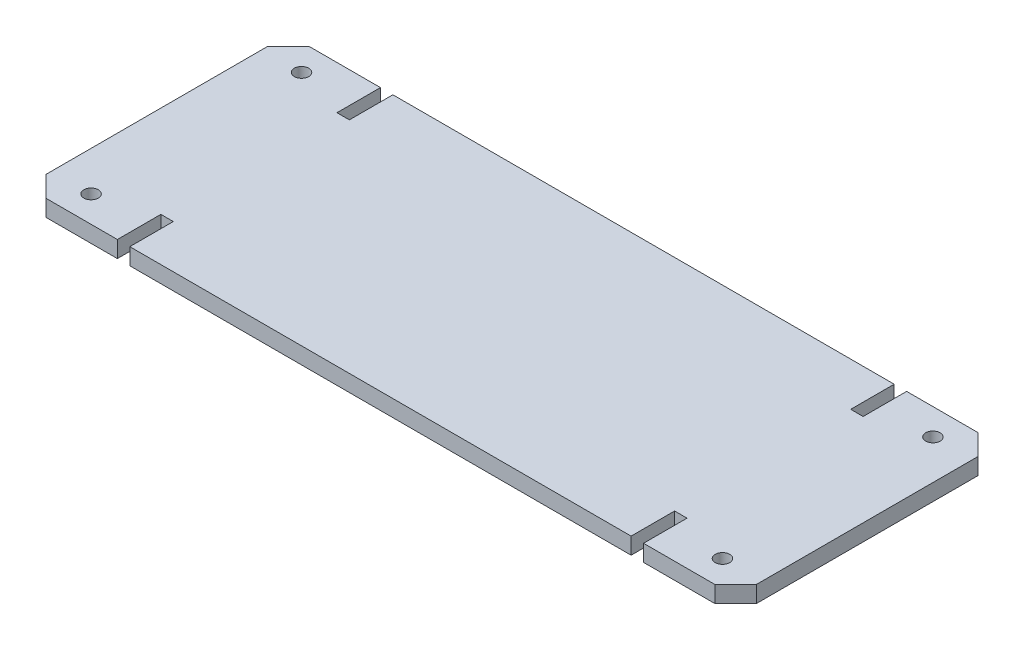
ISO-10303-21;
HEADER;
FILE_DESCRIPTION(('STEP AP214'),'2;1');
FILE_NAME('part.step','',(''),(''),'','','');
FILE_SCHEMA(('AUTOMOTIVE_DESIGN { 1 0 10303 214 1 1 1 1 }'));
ENDSEC;
DATA;
#1=APPLICATION_CONTEXT('core data for automotive mechanical design processes');
#2=APPLICATION_PROTOCOL_DEFINITION('international standard','automotive_design',2000,#1);
#3=PRODUCT_CONTEXT('',#1,'mechanical');
#4=PRODUCT('Part','Part','',(#3));
#5=PRODUCT_RELATED_PRODUCT_CATEGORY('part','',(#4));
#6=PRODUCT_DEFINITION_FORMATION('','',#4);
#7=PRODUCT_DEFINITION_CONTEXT('part definition',#1,'design');
#8=PRODUCT_DEFINITION('design','',#6,#7);
#9=PRODUCT_DEFINITION_SHAPE('','',#8);
#10=(LENGTH_UNIT() NAMED_UNIT(*) SI_UNIT(.MILLI.,.METRE.));
#11=(NAMED_UNIT(*) PLANE_ANGLE_UNIT() SI_UNIT($,.RADIAN.));
#12=(NAMED_UNIT(*) SI_UNIT($,.STERADIAN.) SOLID_ANGLE_UNIT());
#13=UNCERTAINTY_MEASURE_WITH_UNIT(LENGTH_MEASURE(1.E-05),#10,'distance_accuracy_value','');
#14=(GEOMETRIC_REPRESENTATION_CONTEXT(3) GLOBAL_UNCERTAINTY_ASSIGNED_CONTEXT((#13)) GLOBAL_UNIT_ASSIGNED_CONTEXT((#10,
#11,#12)) REPRESENTATION_CONTEXT('',''));
#15=CARTESIAN_POINT('',(0.,0.,0.));
#16=DIRECTION('',(0.,0.,1.));
#17=DIRECTION('',(1.,0.,0.));
#18=AXIS2_PLACEMENT_3D('',#15,#16,#17);
#19=CARTESIAN_POINT('',(-85.725,4.,-31.75));
#20=DIRECTION('',(0.,0.,1.));
#21=DIRECTION('',(1.,0.,0.));
#22=AXIS2_PLACEMENT_3D('',#19,#20,#21);
#23=PLANE('',#22);
#24=DIRECTION('',(-1.,0.,0.));
#25=VECTOR('',#24,1.);
#26=CARTESIAN_POINT('',(-85.725,4.,-31.75));
#27=LINE('',#26,#25);
#28=CARTESIAN_POINT('',(60.5,4.,-31.75));
#29=VERTEX_POINT('',#28);
#30=CARTESIAN_POINT('',(-60.5,4.,-31.75));
#31=VERTEX_POINT('',#30);
#32=EDGE_CURVE('E341',#29,#31,#27,.T.);
#33=ORIENTED_EDGE('',*,*,#32,.F.);
#34=DIRECTION('',(0.,1.,0.));
#35=VECTOR('',#34,1.);
#36=CARTESIAN_POINT('',(60.5,0.,-31.75));
#37=LINE('',#36,#35);
#38=CARTESIAN_POINT('',(60.5,0.,-31.75));
#39=VERTEX_POINT('',#38);
#40=EDGE_CURVE('E227',#39,#29,#37,.T.);
#41=ORIENTED_EDGE('',*,*,#40,.F.);
#42=DIRECTION('',(-1.,0.,0.));
#43=VECTOR('',#42,1.);
#44=CARTESIAN_POINT('',(-85.725,0.,-31.75));
#45=LINE('',#44,#43);
#46=CARTESIAN_POINT('',(-60.5,0.,-31.75));
#47=VERTEX_POINT('',#46);
#48=EDGE_CURVE('E218',#39,#47,#45,.T.);
#49=ORIENTED_EDGE('',*,*,#48,.T.);
#50=DIRECTION('',(0.,1.,0.));
#51=VECTOR('',#50,1.);
#52=CARTESIAN_POINT('',(-60.5,0.,-31.75));
#53=LINE('',#52,#51);
#54=EDGE_CURVE('E266',#47,#31,#53,.T.);
#55=ORIENTED_EDGE('',*,*,#54,.T.);
#56=EDGE_LOOP('',(#33,#41,#49,#55));
#57=FACE_BOUND('',#56,.T.);
#58=ADVANCED_FACE('F33',(#57),#23,.F.);
#59=CARTESIAN_POINT('',(80.725,0.,-31.75));
#60=VERTEX_POINT('',#59);
#61=CARTESIAN_POINT('',(63.5,0.,-31.75));
#62=VERTEX_POINT('',#61);
#63=EDGE_CURVE('E353',#60,#62,#45,.T.);
#64=ORIENTED_EDGE('',*,*,#63,.T.);
#65=DIRECTION('',(0.,1.,0.));
#66=VECTOR('',#65,1.);
#67=CARTESIAN_POINT('',(63.5,0.,-31.75));
#68=LINE('',#67,#66);
#69=CARTESIAN_POINT('',(63.5,4.,-31.75));
#70=VERTEX_POINT('',#69);
#71=EDGE_CURVE('E230',#62,#70,#68,.T.);
#72=ORIENTED_EDGE('',*,*,#71,.T.);
#73=CARTESIAN_POINT('',(80.725,4.,-31.75));
#74=VERTEX_POINT('',#73);
#75=EDGE_CURVE('E337',#74,#70,#27,.T.);
#76=ORIENTED_EDGE('',*,*,#75,.F.);
#77=DIRECTION('',(0.,-1.,0.));
#78=VECTOR('',#77,1.);
#79=CARTESIAN_POINT('',(80.725,4.,-31.75));
#80=LINE('',#79,#78);
#81=EDGE_CURVE('E391',#74,#60,#80,.T.);
#82=ORIENTED_EDGE('',*,*,#81,.T.);
#83=EDGE_LOOP('',(#64,#72,#76,#82));
#84=FACE_BOUND('',#83,.T.);
#85=ADVANCED_FACE('F414',(#84),#23,.F.);
#86=CARTESIAN_POINT('',(-85.725,4.,31.75));
#87=DIRECTION('',(0.,0.,-1.));
#88=DIRECTION('',(-1.,0.,0.));
#89=AXIS2_PLACEMENT_3D('',#86,#87,#88);
#90=PLANE('',#89);
#91=DIRECTION('',(1.,0.,0.));
#92=VECTOR('',#91,1.);
#93=CARTESIAN_POINT('',(-85.725,0.,31.75));
#94=LINE('',#93,#92);
#95=CARTESIAN_POINT('',(-80.7249999999999,0.,31.75));
#96=VERTEX_POINT('',#95);
#97=CARTESIAN_POINT('',(-63.5,0.,31.75));
#98=VERTEX_POINT('',#97);
#99=EDGE_CURVE('E336',#96,#98,#94,.T.);
#100=ORIENTED_EDGE('',*,*,#99,.T.);
#101=DIRECTION('',(0.,1.,0.));
#102=VECTOR('',#101,1.);
#103=CARTESIAN_POINT('',(-63.5,0.,31.75));
#104=LINE('',#103,#102);
#105=CARTESIAN_POINT('',(-63.5,4.,31.75));
#106=VERTEX_POINT('',#105);
#107=EDGE_CURVE('E243',#98,#106,#104,.T.);
#108=ORIENTED_EDGE('',*,*,#107,.T.);
#109=DIRECTION('',(1.,0.,0.));
#110=VECTOR('',#109,1.);
#111=CARTESIAN_POINT('',(-85.725,4.,31.75));
#112=LINE('',#111,#110);
#113=CARTESIAN_POINT('',(-80.7249999999999,4.,31.75));
#114=VERTEX_POINT('',#113);
#115=EDGE_CURVE('E345',#114,#106,#112,.T.);
#116=ORIENTED_EDGE('',*,*,#115,.F.);
#117=DIRECTION('',(0.,-1.,0.));
#118=VECTOR('',#117,1.);
#119=CARTESIAN_POINT('',(-80.7249999999999,4.,31.75));
#120=LINE('',#119,#118);
#121=EDGE_CURVE('E365',#114,#96,#120,.T.);
#122=ORIENTED_EDGE('',*,*,#121,.T.);
#123=EDGE_LOOP('',(#100,#108,#116,#122));
#124=FACE_BOUND('',#123,.T.);
#125=ADVANCED_FACE('F451',(#124),#90,.F.);
#126=CARTESIAN_POINT('',(63.5,4.,31.75));
#127=VERTEX_POINT('',#126);
#128=CARTESIAN_POINT('',(80.725,4.,31.75));
#129=VERTEX_POINT('',#128);
#130=EDGE_CURVE('E344',#127,#129,#112,.T.);
#131=ORIENTED_EDGE('',*,*,#130,.F.);
#132=DIRECTION('',(0.,1.,0.));
#133=VECTOR('',#132,1.);
#134=CARTESIAN_POINT('',(63.5,0.,31.75));
#135=LINE('',#134,#133);
#136=CARTESIAN_POINT('',(63.5,0.,31.75));
#137=VERTEX_POINT('',#136);
#138=EDGE_CURVE('E299',#137,#127,#135,.T.);
#139=ORIENTED_EDGE('',*,*,#138,.F.);
#140=CARTESIAN_POINT('',(80.725,0.,31.75));
#141=VERTEX_POINT('',#140);
#142=EDGE_CURVE('E359',#137,#141,#94,.T.);
#143=ORIENTED_EDGE('',*,*,#142,.T.);
#144=DIRECTION('',(0.,1.,0.));
#145=VECTOR('',#144,1.);
#146=CARTESIAN_POINT('',(80.725,4.,31.75));
#147=LINE('',#146,#145);
#148=EDGE_CURVE('E348',#141,#129,#147,.T.);
#149=ORIENTED_EDGE('',*,*,#148,.T.);
#150=EDGE_LOOP('',(#131,#139,#143,#149));
#151=FACE_BOUND('',#150,.T.);
#152=ADVANCED_FACE('F421',(#151),#90,.F.);
#153=CARTESIAN_POINT('',(0.,4.,0.));
#154=DIRECTION('',(0.,-1.,0.));
#155=DIRECTION('',(0.,0.,-1.));
#156=AXIS2_PLACEMENT_3D('',#153,#154,#155);
#157=PLANE('',#156);
#158=DIRECTION('',(1.,0.,0.));
#159=VECTOR('',#158,1.);
#160=CARTESIAN_POINT('',(63.5,4.,-21.25));
#161=LINE('',#160,#159);
#162=CARTESIAN_POINT('',(60.5,4.,-21.25));
#163=VERTEX_POINT('',#162);
#164=CARTESIAN_POINT('',(63.5,4.,-21.25));
#165=VERTEX_POINT('',#164);
#166=EDGE_CURVE('E220',#163,#165,#161,.T.);
#167=ORIENTED_EDGE('',*,*,#166,.F.);
#168=DIRECTION('',(0.,0.,1.));
#169=VECTOR('',#168,1.);
#170=CARTESIAN_POINT('',(60.5,4.,-21.25));
#171=LINE('',#170,#169);
#172=EDGE_CURVE('E199',#29,#163,#171,.T.);
#173=ORIENTED_EDGE('',*,*,#172,.F.);
#174=ORIENTED_EDGE('',*,*,#32,.T.);
#175=DIRECTION('',(0.,0.,-1.));
#176=VECTOR('',#175,1.);
#177=CARTESIAN_POINT('',(-60.5,4.,-21.25));
#178=LINE('',#177,#176);
#179=CARTESIAN_POINT('',(-60.5,4.,-21.25));
#180=VERTEX_POINT('',#179);
#181=EDGE_CURVE('E267',#180,#31,#178,.T.);
#182=ORIENTED_EDGE('',*,*,#181,.F.);
#183=DIRECTION('',(1.,0.,0.));
#184=VECTOR('',#183,1.);
#185=CARTESIAN_POINT('',(-60.5,4.,-21.25));
#186=LINE('',#185,#184);
#187=CARTESIAN_POINT('',(-63.5,4.,-21.25));
#188=VERTEX_POINT('',#187);
#189=EDGE_CURVE('E261',#188,#180,#186,.T.);
#190=ORIENTED_EDGE('',*,*,#189,.F.);
#191=DIRECTION('',(0.,0.,1.));
#192=VECTOR('',#191,1.);
#193=CARTESIAN_POINT('',(-63.5,4.,-21.25));
#194=LINE('',#193,#192);
#195=CARTESIAN_POINT('',(-63.5,4.,-31.75));
#196=VERTEX_POINT('',#195);
#197=EDGE_CURVE('E269',#196,#188,#194,.T.);
#198=ORIENTED_EDGE('',*,*,#197,.F.);
#199=CARTESIAN_POINT('',(-80.725,4.,-31.75));
#200=VERTEX_POINT('',#199);
#201=EDGE_CURVE('E335',#196,#200,#27,.T.);
#202=ORIENTED_EDGE('',*,*,#201,.T.);
#203=DIRECTION('',(0.707106781186551,0.,-0.707106781186544));
#204=VECTOR('',#203,1.);
#205=CARTESIAN_POINT('',(-85.725,4.,-26.75));
#206=LINE('',#205,#204);
#207=CARTESIAN_POINT('',(-85.725,4.,-26.75));
#208=VERTEX_POINT('',#207);
#209=EDGE_CURVE('E387',#200,#208,#206,.F.);
#210=ORIENTED_EDGE('',*,*,#209,.T.);
#211=DIRECTION('',(0.,0.,1.));
#212=VECTOR('',#211,1.);
#213=CARTESIAN_POINT('',(-85.725,4.,31.75));
#214=LINE('',#213,#212);
#215=CARTESIAN_POINT('',(-85.725,4.,26.7499999999999));
#216=VERTEX_POINT('',#215);
#217=EDGE_CURVE('E340',#208,#216,#214,.T.);
#218=ORIENTED_EDGE('',*,*,#217,.T.);
#219=DIRECTION('',(-0.707106781186548,0.,-0.707106781186548));
#220=VECTOR('',#219,1.);
#221=CARTESIAN_POINT('',(-80.7249999999999,4.,31.75));
#222=LINE('',#221,#220);
#223=EDGE_CURVE('E389',#216,#114,#222,.F.);
#224=ORIENTED_EDGE('',*,*,#223,.T.);
#225=ORIENTED_EDGE('',*,*,#115,.T.);
#226=DIRECTION('',(0.,0.,1.));
#227=VECTOR('',#226,1.);
#228=CARTESIAN_POINT('',(-63.5,4.,31.75));
#229=LINE('',#228,#227);
#230=CARTESIAN_POINT('',(-63.5,4.,21.25));
#231=VERTEX_POINT('',#230);
#232=EDGE_CURVE('E244',#231,#106,#229,.T.);
#233=ORIENTED_EDGE('',*,*,#232,.F.);
#234=DIRECTION('',(-1.,0.,0.));
#235=VECTOR('',#234,1.);
#236=CARTESIAN_POINT('',(-60.5,4.,21.25));
#237=LINE('',#236,#235);
#238=CARTESIAN_POINT('',(-60.5,4.,21.25));
#239=VERTEX_POINT('',#238);
#240=EDGE_CURVE('E237',#239,#231,#237,.T.);
#241=ORIENTED_EDGE('',*,*,#240,.F.);
#242=DIRECTION('',(0.,0.,-1.));
#243=VECTOR('',#242,1.);
#244=CARTESIAN_POINT('',(-60.5,4.,31.75));
#245=LINE('',#244,#243);
#246=CARTESIAN_POINT('',(-60.5,4.,31.75));
#247=VERTEX_POINT('',#246);
#248=EDGE_CURVE('E246',#247,#239,#245,.T.);
#249=ORIENTED_EDGE('',*,*,#248,.F.);
#250=CARTESIAN_POINT('',(60.5,4.,31.75));
#251=VERTEX_POINT('',#250);
#252=EDGE_CURVE('E349',#247,#251,#112,.T.);
#253=ORIENTED_EDGE('',*,*,#252,.T.);
#254=DIRECTION('',(0.,0.,1.));
#255=VECTOR('',#254,1.);
#256=CARTESIAN_POINT('',(60.5,4.,31.75));
#257=LINE('',#256,#255);
#258=CARTESIAN_POINT('',(60.5,4.,21.25));
#259=VERTEX_POINT('',#258);
#260=EDGE_CURVE('E285',#259,#251,#257,.T.);
#261=ORIENTED_EDGE('',*,*,#260,.F.);
#262=DIRECTION('',(-1.,0.,0.));
#263=VECTOR('',#262,1.);
#264=CARTESIAN_POINT('',(63.5,4.,21.25));
#265=LINE('',#264,#263);
#266=CARTESIAN_POINT('',(63.5,4.,21.25));
#267=VERTEX_POINT('',#266);
#268=EDGE_CURVE('E294',#267,#259,#265,.T.);
#269=ORIENTED_EDGE('',*,*,#268,.F.);
#270=DIRECTION('',(0.,0.,-1.));
#271=VECTOR('',#270,1.);
#272=CARTESIAN_POINT('',(63.5,4.,31.75));
#273=LINE('',#272,#271);
#274=EDGE_CURVE('E229',#127,#267,#273,.T.);
#275=ORIENTED_EDGE('',*,*,#274,.F.);
#276=ORIENTED_EDGE('',*,*,#130,.T.);
#277=DIRECTION('',(-0.707106781186551,0.,0.707106781186544));
#278=VECTOR('',#277,1.);
#279=CARTESIAN_POINT('',(85.725,4.,26.75));
#280=LINE('',#279,#278);
#281=CARTESIAN_POINT('',(85.725,4.,26.75));
#282=VERTEX_POINT('',#281);
#283=EDGE_CURVE('E383',#129,#282,#280,.F.);
#284=ORIENTED_EDGE('',*,*,#283,.T.);
#285=DIRECTION('',(0.,0.,-1.));
#286=VECTOR('',#285,1.);
#287=CARTESIAN_POINT('',(85.725,4.,31.75));
#288=LINE('',#287,#286);
#289=CARTESIAN_POINT('',(85.725,4.,-26.7499999999999));
#290=VERTEX_POINT('',#289);
#291=EDGE_CURVE('E332',#282,#290,#288,.T.);
#292=ORIENTED_EDGE('',*,*,#291,.T.);
#293=DIRECTION('',(0.707106781186548,0.,0.707106781186548));
#294=VECTOR('',#293,1.);
#295=CARTESIAN_POINT('',(80.725,4.,-31.75));
#296=LINE('',#295,#294);
#297=EDGE_CURVE('E385',#290,#74,#296,.F.);
#298=ORIENTED_EDGE('',*,*,#297,.T.);
#299=ORIENTED_EDGE('',*,*,#75,.T.);
#300=DIRECTION('',(0.,0.,-1.));
#301=VECTOR('',#300,1.);
#302=CARTESIAN_POINT('',(63.5,4.,-21.25));
#303=LINE('',#302,#301);
#304=EDGE_CURVE('E48',#165,#70,#303,.T.);
#305=ORIENTED_EDGE('',*,*,#304,.F.);
#306=EDGE_LOOP('',(#167,#173,#174,#182,#190,#198,#202,#210,#218,#224,#225,#233,#241,#249,#253,
#261,#269,#275,#276,#284,#292,#298,#299,#305));
#307=FACE_BOUND('',#306,.T.);
#308=CARTESIAN_POINT('',(-76.2,4.,-25.4));
#309=DIRECTION('',(0.,1.,0.));
#310=DIRECTION('',(0.,0.,1.));
#311=AXIS2_PLACEMENT_3D('',#308,#309,#310);
#312=CIRCLE('',#311,1.75);
#313=CARTESIAN_POINT('',(-76.2,4.,-23.65));
#314=VERTEX_POINT('',#313);
#315=EDGE_CURVE('E326',#314,#314,#312,.T.);
#316=ORIENTED_EDGE('',*,*,#315,.F.);
#317=EDGE_LOOP('',(#316));
#318=FACE_BOUND('',#317,.T.);
#319=CARTESIAN_POINT('',(-76.2,4.,25.4));
#320=DIRECTION('',(0.,1.,0.));
#321=DIRECTION('',(0.,0.,1.));
#322=AXIS2_PLACEMENT_3D('',#319,#320,#321);
#323=CIRCLE('',#322,1.75);
#324=CARTESIAN_POINT('',(-76.2,4.,27.15));
#325=VERTEX_POINT('',#324);
#326=EDGE_CURVE('E320',#325,#325,#323,.T.);
#327=ORIENTED_EDGE('',*,*,#326,.F.);
#328=EDGE_LOOP('',(#327));
#329=FACE_BOUND('',#328,.T.);
#330=CARTESIAN_POINT('',(76.2,4.,-25.4));
#331=DIRECTION('',(0.,1.,0.));
#332=DIRECTION('',(0.,0.,1.));
#333=AXIS2_PLACEMENT_3D('',#330,#331,#332);
#334=CIRCLE('',#333,1.75);
#335=CARTESIAN_POINT('',(76.2,4.,-23.65));
#336=VERTEX_POINT('',#335);
#337=EDGE_CURVE('E314',#336,#336,#334,.T.);
#338=ORIENTED_EDGE('',*,*,#337,.F.);
#339=EDGE_LOOP('',(#338));
#340=FACE_BOUND('',#339,.T.);
#341=CARTESIAN_POINT('',(76.2,4.,25.4));
#342=DIRECTION('',(0.,1.,0.));
#343=DIRECTION('',(0.,0.,1.));
#344=AXIS2_PLACEMENT_3D('',#341,#342,#343);
#345=CIRCLE('',#344,1.75);
#346=CARTESIAN_POINT('',(76.2,4.,27.15));
#347=VERTEX_POINT('',#346);
#348=EDGE_CURVE('E308',#347,#347,#345,.T.);
#349=ORIENTED_EDGE('',*,*,#348,.F.);
#350=EDGE_LOOP('',(#349));
#351=FACE_BOUND('',#350,.T.);
#352=ADVANCED_FACE('F416',(#307,#318,#329,#340,#351),#157,.F.);
#353=CARTESIAN_POINT('',(0.,0.,0.));
#354=DIRECTION('',(0.,-1.,0.));
#355=DIRECTION('',(0.,0.,-1.));
#356=AXIS2_PLACEMENT_3D('',#353,#354,#355);
#357=PLANE('',#356);
#358=DIRECTION('',(0.,0.,1.));
#359=VECTOR('',#358,1.);
#360=CARTESIAN_POINT('',(60.5,0.,-21.25));
#361=LINE('',#360,#359);
#362=CARTESIAN_POINT('',(60.5,0.,-21.25));
#363=VERTEX_POINT('',#362);
#364=EDGE_CURVE('E196',#39,#363,#361,.T.);
#365=ORIENTED_EDGE('',*,*,#364,.T.);
#366=DIRECTION('',(1.,0.,0.));
#367=VECTOR('',#366,1.);
#368=CARTESIAN_POINT('',(63.5,0.,-21.25));
#369=LINE('',#368,#367);
#370=CARTESIAN_POINT('',(63.5,0.,-21.25));
#371=VERTEX_POINT('',#370);
#372=EDGE_CURVE('E207',#363,#371,#369,.T.);
#373=ORIENTED_EDGE('',*,*,#372,.T.);
#374=DIRECTION('',(0.,0.,-1.));
#375=VECTOR('',#374,1.);
#376=CARTESIAN_POINT('',(63.5,0.,-21.25));
#377=LINE('',#376,#375);
#378=EDGE_CURVE('E204',#371,#62,#377,.T.);
#379=ORIENTED_EDGE('',*,*,#378,.T.);
#380=ORIENTED_EDGE('',*,*,#63,.F.);
#381=DIRECTION('',(-0.707106781186548,0.,-0.707106781186548));
#382=VECTOR('',#381,1.);
#383=CARTESIAN_POINT('',(56.2375,0.,-56.2375));
#384=LINE('',#383,#382);
#385=CARTESIAN_POINT('',(85.725,0.,-26.7499999999999));
#386=VERTEX_POINT('',#385);
#387=EDGE_CURVE('E371',#60,#386,#384,.F.);
#388=ORIENTED_EDGE('',*,*,#387,.T.);
#389=DIRECTION('',(0.,0.,-1.));
#390=VECTOR('',#389,1.);
#391=CARTESIAN_POINT('',(85.725,0.,31.75));
#392=LINE('',#391,#390);
#393=CARTESIAN_POINT('',(85.725,0.,26.75));
#394=VERTEX_POINT('',#393);
#395=EDGE_CURVE('E329',#394,#386,#392,.T.);
#396=ORIENTED_EDGE('',*,*,#395,.F.);
#397=DIRECTION('',(0.707106781186551,0.,-0.707106781186544));
#398=VECTOR('',#397,1.);
#399=CARTESIAN_POINT('',(56.2374999999995,0.,56.2375000000002));
#400=LINE('',#399,#398);
#401=EDGE_CURVE('E368',#394,#141,#400,.F.);
#402=ORIENTED_EDGE('',*,*,#401,.T.);
#403=ORIENTED_EDGE('',*,*,#142,.F.);
#404=DIRECTION('',(0.,0.,-1.));
#405=VECTOR('',#404,1.);
#406=CARTESIAN_POINT('',(63.5,0.,31.75));
#407=LINE('',#406,#405);
#408=CARTESIAN_POINT('',(63.5,0.,21.25));
#409=VERTEX_POINT('',#408);
#410=EDGE_CURVE('E281',#137,#409,#407,.T.);
#411=ORIENTED_EDGE('',*,*,#410,.T.);
#412=DIRECTION('',(-1.,0.,0.));
#413=VECTOR('',#412,1.);
#414=CARTESIAN_POINT('',(63.5,0.,21.25));
#415=LINE('',#414,#413);
#416=CARTESIAN_POINT('',(60.5,0.,21.25));
#417=VERTEX_POINT('',#416);
#418=EDGE_CURVE('E284',#409,#417,#415,.T.);
#419=ORIENTED_EDGE('',*,*,#418,.T.);
#420=DIRECTION('',(0.,0.,1.));
#421=VECTOR('',#420,1.);
#422=CARTESIAN_POINT('',(60.5,0.,31.75));
#423=LINE('',#422,#421);
#424=CARTESIAN_POINT('',(60.5,0.,31.75));
#425=VERTEX_POINT('',#424);
#426=EDGE_CURVE('E288',#417,#425,#423,.T.);
#427=ORIENTED_EDGE('',*,*,#426,.T.);
#428=CARTESIAN_POINT('',(-60.5,0.,31.75));
#429=VERTEX_POINT('',#428);
#430=EDGE_CURVE('E362',#429,#425,#94,.T.);
#431=ORIENTED_EDGE('',*,*,#430,.F.);
#432=DIRECTION('',(0.,0.,-1.));
#433=VECTOR('',#432,1.);
#434=CARTESIAN_POINT('',(-60.5,0.,31.75));
#435=LINE('',#434,#433);
#436=CARTESIAN_POINT('',(-60.5,0.,21.25));
#437=VERTEX_POINT('',#436);
#438=EDGE_CURVE('E236',#429,#437,#435,.T.);
#439=ORIENTED_EDGE('',*,*,#438,.T.);
#440=DIRECTION('',(-1.,0.,0.));
#441=VECTOR('',#440,1.);
#442=CARTESIAN_POINT('',(-60.5,0.,21.25));
#443=LINE('',#442,#441);
#444=CARTESIAN_POINT('',(-63.5,0.,21.25));
#445=VERTEX_POINT('',#444);
#446=EDGE_CURVE('E240',#437,#445,#443,.T.);
#447=ORIENTED_EDGE('',*,*,#446,.T.);
#448=DIRECTION('',(0.,0.,1.));
#449=VECTOR('',#448,1.);
#450=CARTESIAN_POINT('',(-63.5,0.,31.75));
#451=LINE('',#450,#449);
#452=EDGE_CURVE('E233',#445,#98,#451,.T.);
#453=ORIENTED_EDGE('',*,*,#452,.T.);
#454=ORIENTED_EDGE('',*,*,#99,.F.);
#455=DIRECTION('',(0.707106781186548,0.,0.707106781186548));
#456=VECTOR('',#455,1.);
#457=CARTESIAN_POINT('',(-56.2375,0.,56.2375));
#458=LINE('',#457,#456);
#459=CARTESIAN_POINT('',(-85.725,0.,26.7499999999999));
#460=VERTEX_POINT('',#459);
#461=EDGE_CURVE('E376',#96,#460,#458,.F.);
#462=ORIENTED_EDGE('',*,*,#461,.T.);
#463=DIRECTION('',(0.,0.,1.));
#464=VECTOR('',#463,1.);
#465=CARTESIAN_POINT('',(-85.725,0.,31.75));
#466=LINE('',#465,#464);
#467=CARTESIAN_POINT('',(-85.725,0.,-26.75));
#468=VERTEX_POINT('',#467);
#469=EDGE_CURVE('E356',#468,#460,#466,.T.);
#470=ORIENTED_EDGE('',*,*,#469,.F.);
#471=DIRECTION('',(-0.707106781186551,0.,0.707106781186544));
#472=VECTOR('',#471,1.);
#473=CARTESIAN_POINT('',(-56.2374999999995,0.,-56.2375000000002));
#474=LINE('',#473,#472);
#475=CARTESIAN_POINT('',(-80.725,0.,-31.75));
#476=VERTEX_POINT('',#475);
#477=EDGE_CURVE('E373',#468,#476,#474,.F.);
#478=ORIENTED_EDGE('',*,*,#477,.T.);
#479=CARTESIAN_POINT('',(-63.5,0.,-31.75));
#480=VERTEX_POINT('',#479);
#481=EDGE_CURVE('E352',#480,#476,#45,.T.);
#482=ORIENTED_EDGE('',*,*,#481,.F.);
#483=DIRECTION('',(0.,0.,1.));
#484=VECTOR('',#483,1.);
#485=CARTESIAN_POINT('',(-63.5,0.,-21.25));
#486=LINE('',#485,#484);
#487=CARTESIAN_POINT('',(-63.5,0.,-21.25));
#488=VERTEX_POINT('',#487);
#489=EDGE_CURVE('E56',#480,#488,#486,.T.);
#490=ORIENTED_EDGE('',*,*,#489,.T.);
#491=DIRECTION('',(1.,0.,0.));
#492=VECTOR('',#491,1.);
#493=CARTESIAN_POINT('',(-60.5,0.,-21.25));
#494=LINE('',#493,#492);
#495=CARTESIAN_POINT('',(-60.5,0.,-21.25));
#496=VERTEX_POINT('',#495);
#497=EDGE_CURVE('E263',#488,#496,#494,.T.);
#498=ORIENTED_EDGE('',*,*,#497,.T.);
#499=DIRECTION('',(0.,0.,-1.));
#500=VECTOR('',#499,1.);
#501=CARTESIAN_POINT('',(-60.5,0.,-21.25));
#502=LINE('',#501,#500);
#503=EDGE_CURVE('E259',#496,#47,#502,.T.);
#504=ORIENTED_EDGE('',*,*,#503,.T.);
#505=ORIENTED_EDGE('',*,*,#48,.F.);
#506=EDGE_LOOP('',(#365,#373,#379,#380,#388,#396,#402,#403,#411,#419,#427,#431,#439,#447,#453,
#454,#462,#470,#478,#482,#490,#498,#504,#505));
#507=FACE_BOUND('',#506,.T.);
#508=CARTESIAN_POINT('',(76.2,0.,-25.4));
#509=DIRECTION('',(0.,1.,0.));
#510=DIRECTION('',(0.,0.,1.));
#511=AXIS2_PLACEMENT_3D('',#508,#509,#510);
#512=CIRCLE('',#511,1.75);
#513=CARTESIAN_POINT('',(76.2,0.,-23.65));
#514=VERTEX_POINT('',#513);
#515=EDGE_CURVE('E311',#514,#514,#512,.T.);
#516=ORIENTED_EDGE('',*,*,#515,.T.);
#517=EDGE_LOOP('',(#516));
#518=FACE_BOUND('',#517,.T.);
#519=CARTESIAN_POINT('',(-76.2,0.,-25.4));
#520=DIRECTION('',(0.,1.,0.));
#521=DIRECTION('',(0.,0.,1.));
#522=AXIS2_PLACEMENT_3D('',#519,#520,#521);
#523=CIRCLE('',#522,1.75);
#524=CARTESIAN_POINT('',(-76.2,0.,-23.65));
#525=VERTEX_POINT('',#524);
#526=EDGE_CURVE('E323',#525,#525,#523,.T.);
#527=ORIENTED_EDGE('',*,*,#526,.T.);
#528=EDGE_LOOP('',(#527));
#529=FACE_BOUND('',#528,.T.);
#530=CARTESIAN_POINT('',(-76.2,0.,25.4));
#531=DIRECTION('',(0.,1.,0.));
#532=DIRECTION('',(0.,0.,1.));
#533=AXIS2_PLACEMENT_3D('',#530,#531,#532);
#534=CIRCLE('',#533,1.75);
#535=CARTESIAN_POINT('',(-76.2,0.,27.15));
#536=VERTEX_POINT('',#535);
#537=EDGE_CURVE('E317',#536,#536,#534,.T.);
#538=ORIENTED_EDGE('',*,*,#537,.T.);
#539=EDGE_LOOP('',(#538));
#540=FACE_BOUND('',#539,.T.);
#541=CARTESIAN_POINT('',(76.2,0.,25.4));
#542=DIRECTION('',(0.,1.,0.));
#543=DIRECTION('',(0.,0.,1.));
#544=AXIS2_PLACEMENT_3D('',#541,#542,#543);
#545=CIRCLE('',#544,1.75);
#546=CARTESIAN_POINT('',(76.2,0.,27.15));
#547=VERTEX_POINT('',#546);
#548=EDGE_CURVE('E301',#547,#547,#545,.T.);
#549=ORIENTED_EDGE('',*,*,#548,.T.);
#550=EDGE_LOOP('',(#549));
#551=FACE_BOUND('',#550,.T.);
#552=ADVANCED_FACE('F214',(#507,#518,#529,#540,#551),#357,.T.);
#553=CARTESIAN_POINT('',(85.725,4.,31.75));
#554=DIRECTION('',(-1.,0.,0.));
#555=DIRECTION('',(0.,0.,1.));
#556=AXIS2_PLACEMENT_3D('',#553,#554,#555);
#557=PLANE('',#556);
#558=ORIENTED_EDGE('',*,*,#395,.T.);
#559=DIRECTION('',(0.,1.,0.));
#560=VECTOR('',#559,1.);
#561=CARTESIAN_POINT('',(85.725,4.,-26.7499999999999));
#562=LINE('',#561,#560);
#563=EDGE_CURVE('E11',#386,#290,#562,.T.);
#564=ORIENTED_EDGE('',*,*,#563,.T.);
#565=ORIENTED_EDGE('',*,*,#291,.F.);
#566=DIRECTION('',(0.,-1.,0.));
#567=VECTOR('',#566,1.);
#568=CARTESIAN_POINT('',(85.725,4.,26.75));
#569=LINE('',#568,#567);
#570=EDGE_CURVE('E41',#282,#394,#569,.T.);
#571=ORIENTED_EDGE('',*,*,#570,.T.);
#572=EDGE_LOOP('',(#558,#564,#565,#571));
#573=FACE_BOUND('',#572,.T.);
#574=ADVANCED_FACE('F401',(#573),#557,.F.);
#575=ORIENTED_EDGE('',*,*,#201,.F.);
#576=DIRECTION('',(0.,1.,0.));
#577=VECTOR('',#576,1.);
#578=CARTESIAN_POINT('',(-63.5,0.,-31.75));
#579=LINE('',#578,#577);
#580=EDGE_CURVE('E277',#480,#196,#579,.T.);
#581=ORIENTED_EDGE('',*,*,#580,.F.);
#582=ORIENTED_EDGE('',*,*,#481,.T.);
#583=DIRECTION('',(0.,1.,0.));
#584=VECTOR('',#583,1.);
#585=CARTESIAN_POINT('',(-80.725,4.,-31.75));
#586=LINE('',#585,#584);
#587=EDGE_CURVE('E394',#476,#200,#586,.T.);
#588=ORIENTED_EDGE('',*,*,#587,.T.);
#589=EDGE_LOOP('',(#575,#581,#582,#588));
#590=FACE_BOUND('',#589,.T.);
#591=ADVANCED_FACE('F475',(#590),#23,.F.);
#592=CARTESIAN_POINT('',(-85.725,4.,31.75));
#593=DIRECTION('',(1.,0.,0.));
#594=DIRECTION('',(0.,0.,-1.));
#595=AXIS2_PLACEMENT_3D('',#592,#593,#594);
#596=PLANE('',#595);
#597=ORIENTED_EDGE('',*,*,#469,.T.);
#598=DIRECTION('',(0.,1.,0.));
#599=VECTOR('',#598,1.);
#600=CARTESIAN_POINT('',(-85.725,4.,26.7499999999999));
#601=LINE('',#600,#599);
#602=EDGE_CURVE('E381',#460,#216,#601,.T.);
#603=ORIENTED_EDGE('',*,*,#602,.T.);
#604=ORIENTED_EDGE('',*,*,#217,.F.);
#605=DIRECTION('',(0.,-1.,0.));
#606=VECTOR('',#605,1.);
#607=CARTESIAN_POINT('',(-85.725,4.,-26.75));
#608=LINE('',#607,#606);
#609=EDGE_CURVE('E378',#208,#468,#608,.T.);
#610=ORIENTED_EDGE('',*,*,#609,.T.);
#611=EDGE_LOOP('',(#597,#603,#604,#610));
#612=FACE_BOUND('',#611,.T.);
#613=ADVANCED_FACE('F460',(#612),#596,.F.);
#614=ORIENTED_EDGE('',*,*,#252,.F.);
#615=DIRECTION('',(0.,1.,0.));
#616=VECTOR('',#615,1.);
#617=CARTESIAN_POINT('',(-60.5,0.,31.75));
#618=LINE('',#617,#616);
#619=EDGE_CURVE('E255',#429,#247,#618,.T.);
#620=ORIENTED_EDGE('',*,*,#619,.F.);
#621=ORIENTED_EDGE('',*,*,#430,.T.);
#622=DIRECTION('',(0.,1.,0.));
#623=VECTOR('',#622,1.);
#624=CARTESIAN_POINT('',(60.5,0.,31.75));
#625=LINE('',#624,#623);
#626=EDGE_CURVE('E302',#425,#251,#625,.T.);
#627=ORIENTED_EDGE('',*,*,#626,.T.);
#628=EDGE_LOOP('',(#614,#620,#621,#627));
#629=FACE_BOUND('',#628,.T.);
#630=ADVANCED_FACE('F428',(#629),#90,.F.);
#631=CARTESIAN_POINT('',(-76.2,4.,-25.4));
#632=DIRECTION('',(0.,-1.,0.));
#633=DIRECTION('',(0.,0.,-1.));
#634=AXIS2_PLACEMENT_3D('',#631,#632,#633);
#635=CYLINDRICAL_SURFACE('',#634,1.75);
#636=ORIENTED_EDGE('',*,*,#315,.T.);
#637=EDGE_LOOP('',(#636));
#638=FACE_BOUND('',#637,.T.);
#639=ORIENTED_EDGE('',*,*,#526,.F.);
#640=EDGE_LOOP('',(#639));
#641=FACE_BOUND('',#640,.T.);
#642=ADVANCED_FACE('F495',(#638,#641),#635,.F.);
#643=CARTESIAN_POINT('',(-76.2,4.,25.4));
#644=DIRECTION('',(0.,-1.,0.));
#645=DIRECTION('',(0.,0.,-1.));
#646=AXIS2_PLACEMENT_3D('',#643,#644,#645);
#647=CYLINDRICAL_SURFACE('',#646,1.75);
#648=ORIENTED_EDGE('',*,*,#326,.T.);
#649=EDGE_LOOP('',(#648));
#650=FACE_BOUND('',#649,.T.);
#651=ORIENTED_EDGE('',*,*,#537,.F.);
#652=EDGE_LOOP('',(#651));
#653=FACE_BOUND('',#652,.T.);
#654=ADVANCED_FACE('F499',(#650,#653),#647,.F.);
#655=CARTESIAN_POINT('',(76.2,4.,-25.4));
#656=DIRECTION('',(0.,-1.,0.));
#657=DIRECTION('',(0.,0.,-1.));
#658=AXIS2_PLACEMENT_3D('',#655,#656,#657);
#659=CYLINDRICAL_SURFACE('',#658,1.75);
#660=ORIENTED_EDGE('',*,*,#337,.T.);
#661=EDGE_LOOP('',(#660));
#662=FACE_BOUND('',#661,.T.);
#663=ORIENTED_EDGE('',*,*,#515,.F.);
#664=EDGE_LOOP('',(#663));
#665=FACE_BOUND('',#664,.T.);
#666=ADVANCED_FACE('F505',(#662,#665),#659,.F.);
#667=CARTESIAN_POINT('',(76.2,4.,25.4));
#668=DIRECTION('',(0.,-1.,0.));
#669=DIRECTION('',(0.,0.,-1.));
#670=AXIS2_PLACEMENT_3D('',#667,#668,#669);
#671=CYLINDRICAL_SURFACE('',#670,1.75);
#672=ORIENTED_EDGE('',*,*,#348,.T.);
#673=EDGE_LOOP('',(#672));
#674=FACE_BOUND('',#673,.T.);
#675=ORIENTED_EDGE('',*,*,#548,.F.);
#676=EDGE_LOOP('',(#675));
#677=FACE_BOUND('',#676,.T.);
#678=ADVANCED_FACE('F528',(#674,#677),#671,.F.);
#679=CARTESIAN_POINT('',(-80.7249999999999,4.,31.75));
#680=DIRECTION('',(0.707106781186547,0.,-0.707106781186547));
#681=DIRECTION('',(0.,-1.,0.));
#682=AXIS2_PLACEMENT_3D('',#679,#680,#681);
#683=PLANE('',#682);
#684=ORIENTED_EDGE('',*,*,#223,.F.);
#685=ORIENTED_EDGE('',*,*,#602,.F.);
#686=ORIENTED_EDGE('',*,*,#461,.F.);
#687=ORIENTED_EDGE('',*,*,#121,.F.);
#688=EDGE_LOOP('',(#684,#685,#686,#687));
#689=FACE_BOUND('',#688,.T.);
#690=ADVANCED_FACE('F457',(#689),#683,.F.);
#691=CARTESIAN_POINT('',(-85.725,4.,-26.75));
#692=DIRECTION('',(0.707106781186544,0.,0.707106781186551));
#693=DIRECTION('',(0.,-1.,0.));
#694=AXIS2_PLACEMENT_3D('',#691,#692,#693);
#695=PLANE('',#694);
#696=ORIENTED_EDGE('',*,*,#209,.F.);
#697=ORIENTED_EDGE('',*,*,#587,.F.);
#698=ORIENTED_EDGE('',*,*,#477,.F.);
#699=ORIENTED_EDGE('',*,*,#609,.F.);
#700=EDGE_LOOP('',(#696,#697,#698,#699));
#701=FACE_BOUND('',#700,.T.);
#702=ADVANCED_FACE('F464',(#701),#695,.F.);
#703=CARTESIAN_POINT('',(80.725,4.,-31.75));
#704=DIRECTION('',(-0.707106781186547,0.,0.707106781186547));
#705=DIRECTION('',(0.,-1.,0.));
#706=AXIS2_PLACEMENT_3D('',#703,#704,#705);
#707=PLANE('',#706);
#708=ORIENTED_EDGE('',*,*,#297,.F.);
#709=ORIENTED_EDGE('',*,*,#563,.F.);
#710=ORIENTED_EDGE('',*,*,#387,.F.);
#711=ORIENTED_EDGE('',*,*,#81,.F.);
#712=EDGE_LOOP('',(#708,#709,#710,#711));
#713=FACE_BOUND('',#712,.T.);
#714=ADVANCED_FACE('F411',(#713),#707,.F.);
#715=CARTESIAN_POINT('',(85.725,4.,26.75));
#716=DIRECTION('',(-0.707106781186544,0.,-0.707106781186551));
#717=DIRECTION('',(0.,-1.,0.));
#718=AXIS2_PLACEMENT_3D('',#715,#716,#717);
#719=PLANE('',#718);
#720=ORIENTED_EDGE('',*,*,#283,.F.);
#721=ORIENTED_EDGE('',*,*,#148,.F.);
#722=ORIENTED_EDGE('',*,*,#401,.F.);
#723=ORIENTED_EDGE('',*,*,#570,.F.);
#724=EDGE_LOOP('',(#720,#721,#722,#723));
#725=FACE_BOUND('',#724,.T.);
#726=ADVANCED_FACE('F35',(#725),#719,.F.);
#727=CARTESIAN_POINT('',(63.5,0.,31.75));
#728=DIRECTION('',(1.,0.,0.));
#729=DIRECTION('',(0.,0.,-1.));
#730=AXIS2_PLACEMENT_3D('',#727,#728,#729);
#731=PLANE('',#730);
#732=ORIENTED_EDGE('',*,*,#274,.T.);
#733=DIRECTION('',(0.,1.,0.));
#734=VECTOR('',#733,1.);
#735=CARTESIAN_POINT('',(63.5,0.,21.25));
#736=LINE('',#735,#734);
#737=EDGE_CURVE('E291',#409,#267,#736,.T.);
#738=ORIENTED_EDGE('',*,*,#737,.F.);
#739=ORIENTED_EDGE('',*,*,#410,.F.);
#740=ORIENTED_EDGE('',*,*,#138,.T.);
#741=EDGE_LOOP('',(#732,#738,#739,#740));
#742=FACE_BOUND('',#741,.T.);
#743=ADVANCED_FACE('F567',(#742),#731,.F.);
#744=CARTESIAN_POINT('',(60.5,0.,31.75));
#745=DIRECTION('',(-1.,0.,0.));
#746=DIRECTION('',(0.,0.,1.));
#747=AXIS2_PLACEMENT_3D('',#744,#745,#746);
#748=PLANE('',#747);
#749=ORIENTED_EDGE('',*,*,#260,.T.);
#750=ORIENTED_EDGE('',*,*,#626,.F.);
#751=ORIENTED_EDGE('',*,*,#426,.F.);
#752=DIRECTION('',(0.,1.,0.));
#753=VECTOR('',#752,1.);
#754=CARTESIAN_POINT('',(60.5,0.,21.25));
#755=LINE('',#754,#753);
#756=EDGE_CURVE('E305',#417,#259,#755,.T.);
#757=ORIENTED_EDGE('',*,*,#756,.T.);
#758=EDGE_LOOP('',(#749,#750,#751,#757));
#759=FACE_BOUND('',#758,.T.);
#760=ADVANCED_FACE('F431',(#759),#748,.F.);
#761=CARTESIAN_POINT('',(63.5,0.,21.25));
#762=DIRECTION('',(0.,0.,-1.));
#763=DIRECTION('',(-1.,0.,0.));
#764=AXIS2_PLACEMENT_3D('',#761,#762,#763);
#765=PLANE('',#764);
#766=ORIENTED_EDGE('',*,*,#268,.T.);
#767=ORIENTED_EDGE('',*,*,#756,.F.);
#768=ORIENTED_EDGE('',*,*,#418,.F.);
#769=ORIENTED_EDGE('',*,*,#737,.T.);
#770=EDGE_LOOP('',(#766,#767,#768,#769));
#771=FACE_BOUND('',#770,.T.);
#772=ADVANCED_FACE('F435',(#771),#765,.F.);
#773=CARTESIAN_POINT('',(-63.5,0.,31.75));
#774=DIRECTION('',(-1.,0.,0.));
#775=DIRECTION('',(0.,0.,1.));
#776=AXIS2_PLACEMENT_3D('',#773,#774,#775);
#777=PLANE('',#776);
#778=ORIENTED_EDGE('',*,*,#232,.T.);
#779=ORIENTED_EDGE('',*,*,#107,.F.);
#780=ORIENTED_EDGE('',*,*,#452,.F.);
#781=DIRECTION('',(0.,1.,0.));
#782=VECTOR('',#781,1.);
#783=CARTESIAN_POINT('',(-63.5,0.,21.25));
#784=LINE('',#783,#782);
#785=EDGE_CURVE('E225',#445,#231,#784,.T.);
#786=ORIENTED_EDGE('',*,*,#785,.T.);
#787=EDGE_LOOP('',(#778,#779,#780,#786));
#788=FACE_BOUND('',#787,.T.);
#789=ADVANCED_FACE('F448',(#788),#777,.F.);
#790=CARTESIAN_POINT('',(-60.5,0.,21.25));
#791=DIRECTION('',(0.,0.,-1.));
#792=DIRECTION('',(-1.,0.,0.));
#793=AXIS2_PLACEMENT_3D('',#790,#791,#792);
#794=PLANE('',#793);
#795=ORIENTED_EDGE('',*,*,#240,.T.);
#796=ORIENTED_EDGE('',*,*,#785,.F.);
#797=ORIENTED_EDGE('',*,*,#446,.F.);
#798=DIRECTION('',(0.,1.,0.));
#799=VECTOR('',#798,1.);
#800=CARTESIAN_POINT('',(-60.5,0.,21.25));
#801=LINE('',#800,#799);
#802=EDGE_CURVE('E253',#437,#239,#801,.T.);
#803=ORIENTED_EDGE('',*,*,#802,.T.);
#804=EDGE_LOOP('',(#795,#796,#797,#803));
#805=FACE_BOUND('',#804,.T.);
#806=ADVANCED_FACE('F446',(#805),#794,.F.);
#807=CARTESIAN_POINT('',(-60.5,0.,31.75));
#808=DIRECTION('',(1.,0.,0.));
#809=DIRECTION('',(0.,0.,-1.));
#810=AXIS2_PLACEMENT_3D('',#807,#808,#809);
#811=PLANE('',#810);
#812=ORIENTED_EDGE('',*,*,#248,.T.);
#813=ORIENTED_EDGE('',*,*,#802,.F.);
#814=ORIENTED_EDGE('',*,*,#438,.F.);
#815=ORIENTED_EDGE('',*,*,#619,.T.);
#816=EDGE_LOOP('',(#812,#813,#814,#815));
#817=FACE_BOUND('',#816,.T.);
#818=ADVANCED_FACE('F441',(#817),#811,.F.);
#819=CARTESIAN_POINT('',(-60.5,0.,-21.25));
#820=DIRECTION('',(1.,0.,0.));
#821=DIRECTION('',(0.,0.,-1.));
#822=AXIS2_PLACEMENT_3D('',#819,#820,#821);
#823=PLANE('',#822);
#824=ORIENTED_EDGE('',*,*,#181,.T.);
#825=ORIENTED_EDGE('',*,*,#54,.F.);
#826=ORIENTED_EDGE('',*,*,#503,.F.);
#827=DIRECTION('',(0.,1.,0.));
#828=VECTOR('',#827,1.);
#829=CARTESIAN_POINT('',(-60.5,0.,-21.25));
#830=LINE('',#829,#828);
#831=EDGE_CURVE('E247',#496,#180,#830,.T.);
#832=ORIENTED_EDGE('',*,*,#831,.T.);
#833=EDGE_LOOP('',(#824,#825,#826,#832));
#834=FACE_BOUND('',#833,.T.);
#835=ADVANCED_FACE('F638',(#834),#823,.F.);
#836=CARTESIAN_POINT('',(-60.5,0.,-21.25));
#837=DIRECTION('',(0.,0.,1.));
#838=DIRECTION('',(1.,0.,0.));
#839=AXIS2_PLACEMENT_3D('',#836,#837,#838);
#840=PLANE('',#839);
#841=ORIENTED_EDGE('',*,*,#189,.T.);
#842=ORIENTED_EDGE('',*,*,#831,.F.);
#843=ORIENTED_EDGE('',*,*,#497,.F.);
#844=DIRECTION('',(0.,1.,0.));
#845=VECTOR('',#844,1.);
#846=CARTESIAN_POINT('',(-63.5,0.,-21.25));
#847=LINE('',#846,#845);
#848=EDGE_CURVE('E275',#488,#188,#847,.T.);
#849=ORIENTED_EDGE('',*,*,#848,.T.);
#850=EDGE_LOOP('',(#841,#842,#843,#849));
#851=FACE_BOUND('',#850,.T.);
#852=ADVANCED_FACE('F646',(#851),#840,.F.);
#853=CARTESIAN_POINT('',(-63.5,0.,-21.25));
#854=DIRECTION('',(-1.,0.,0.));
#855=DIRECTION('',(0.,0.,1.));
#856=AXIS2_PLACEMENT_3D('',#853,#854,#855);
#857=PLANE('',#856);
#858=ORIENTED_EDGE('',*,*,#197,.T.);
#859=ORIENTED_EDGE('',*,*,#848,.F.);
#860=ORIENTED_EDGE('',*,*,#489,.F.);
#861=ORIENTED_EDGE('',*,*,#580,.T.);
#862=EDGE_LOOP('',(#858,#859,#860,#861));
#863=FACE_BOUND('',#862,.T.);
#864=ADVANCED_FACE('F655',(#863),#857,.F.);
#865=CARTESIAN_POINT('',(60.5,0.,-21.25));
#866=DIRECTION('',(-1.,0.,0.));
#867=DIRECTION('',(0.,0.,1.));
#868=AXIS2_PLACEMENT_3D('',#865,#866,#867);
#869=PLANE('',#868);
#870=ORIENTED_EDGE('',*,*,#172,.T.);
#871=DIRECTION('',(0.,1.,0.));
#872=VECTOR('',#871,1.);
#873=CARTESIAN_POINT('',(60.5,0.,-21.25));
#874=LINE('',#873,#872);
#875=EDGE_CURVE('E192',#363,#163,#874,.T.);
#876=ORIENTED_EDGE('',*,*,#875,.F.);
#877=ORIENTED_EDGE('',*,*,#364,.F.);
#878=ORIENTED_EDGE('',*,*,#40,.T.);
#879=EDGE_LOOP('',(#870,#876,#877,#878));
#880=FACE_BOUND('',#879,.T.);
#881=ADVANCED_FACE('F194',(#880),#869,.F.);
#882=CARTESIAN_POINT('',(63.5,0.,-21.25));
#883=DIRECTION('',(1.,0.,0.));
#884=DIRECTION('',(0.,0.,-1.));
#885=AXIS2_PLACEMENT_3D('',#882,#883,#884);
#886=PLANE('',#885);
#887=ORIENTED_EDGE('',*,*,#304,.T.);
#888=ORIENTED_EDGE('',*,*,#71,.F.);
#889=ORIENTED_EDGE('',*,*,#378,.F.);
#890=DIRECTION('',(0.,1.,0.));
#891=VECTOR('',#890,1.);
#892=CARTESIAN_POINT('',(63.5,0.,-21.25));
#893=LINE('',#892,#891);
#894=EDGE_CURVE('E203',#371,#165,#893,.T.);
#895=ORIENTED_EDGE('',*,*,#894,.T.);
#896=EDGE_LOOP('',(#887,#888,#889,#895));
#897=FACE_BOUND('',#896,.T.);
#898=ADVANCED_FACE('F671',(#897),#886,.F.);
#899=CARTESIAN_POINT('',(63.5,0.,-21.25));
#900=DIRECTION('',(0.,0.,1.));
#901=DIRECTION('',(1.,0.,0.));
#902=AXIS2_PLACEMENT_3D('',#899,#900,#901);
#903=PLANE('',#902);
#904=ORIENTED_EDGE('',*,*,#166,.T.);
#905=ORIENTED_EDGE('',*,*,#894,.F.);
#906=ORIENTED_EDGE('',*,*,#372,.F.);
#907=ORIENTED_EDGE('',*,*,#875,.T.);
#908=EDGE_LOOP('',(#904,#905,#906,#907));
#909=FACE_BOUND('',#908,.T.);
#910=ADVANCED_FACE('F208',(#909),#903,.F.);
#911=CLOSED_SHELL('',(#58,#85,#125,#152,#352,#552,#574,#591,#613,#630,#642,#654,#666,#678,#690,
#702,#714,#726,#743,#760,#772,#789,#806,#818,#835,#852,#864,#881,#898,#910));
#912=MANIFOLD_SOLID_BREP('B2',#911);
#913=ADVANCED_BREP_SHAPE_REPRESENTATION('',(#18,#912),#14);
#914=SHAPE_DEFINITION_REPRESENTATION(#9,#913);
ENDSEC;
END-ISO-10303-21;
